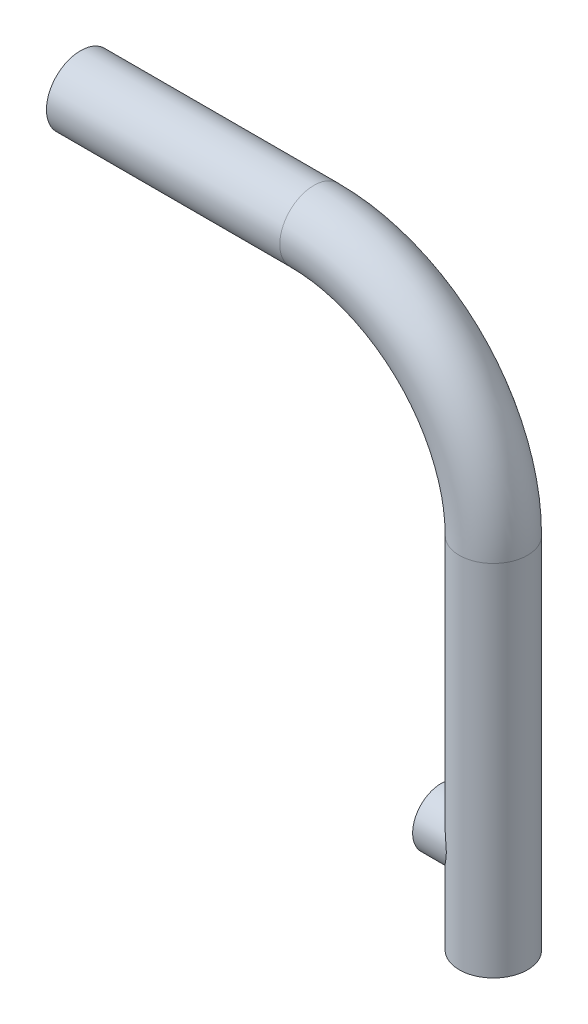
ISO-10303-21;
HEADER;
FILE_DESCRIPTION(('STEP AP214'),'2;1');
FILE_NAME('part.step','',(''),(''),'','','');
FILE_SCHEMA(('AUTOMOTIVE_DESIGN { 1 0 10303 214 1 1 1 1 }'));
ENDSEC;
DATA;
#1=APPLICATION_CONTEXT('core data for automotive mechanical design processes');
#2=APPLICATION_PROTOCOL_DEFINITION('international standard','automotive_design',2000,#1);
#3=PRODUCT_CONTEXT('',#1,'mechanical');
#4=PRODUCT('Part','Part','',(#3));
#5=PRODUCT_RELATED_PRODUCT_CATEGORY('part','',(#4));
#6=PRODUCT_DEFINITION_FORMATION('','',#4);
#7=PRODUCT_DEFINITION_CONTEXT('part definition',#1,'design');
#8=PRODUCT_DEFINITION('design','',#6,#7);
#9=PRODUCT_DEFINITION_SHAPE('','',#8);
#10=(LENGTH_UNIT() NAMED_UNIT(*) SI_UNIT(.MILLI.,.METRE.));
#11=(NAMED_UNIT(*) PLANE_ANGLE_UNIT() SI_UNIT($,.RADIAN.));
#12=(NAMED_UNIT(*) SI_UNIT($,.STERADIAN.) SOLID_ANGLE_UNIT());
#13=UNCERTAINTY_MEASURE_WITH_UNIT(LENGTH_MEASURE(1.E-05),#10,'distance_accuracy_value','');
#14=(GEOMETRIC_REPRESENTATION_CONTEXT(3) GLOBAL_UNCERTAINTY_ASSIGNED_CONTEXT((#13)) GLOBAL_UNIT_ASSIGNED_CONTEXT((#10,
#11,#12)) REPRESENTATION_CONTEXT('',''));
#15=CARTESIAN_POINT('',(0.,0.,0.));
#16=DIRECTION('',(0.,0.,1.));
#17=DIRECTION('',(1.,0.,0.));
#18=AXIS2_PLACEMENT_3D('',#15,#16,#17);
#19=CARTESIAN_POINT('',(80.2564105885616,-44.1229147782417,0.));
#20=DIRECTION('',(0.,-1.,0.));
#21=DIRECTION('',(1.,0.,0.));
#22=AXIS2_PLACEMENT_3D('',#19,#20,#21);
#23=CYLINDRICAL_SURFACE('',#22,19.);
#24=CARTESIAN_POINT('',(80.2564105885616,-244.122914778242,0.));
#25=DIRECTION('',(0.,1.,0.));
#26=DIRECTION('',(-1.,0.,0.));
#27=AXIS2_PLACEMENT_3D('',#24,#25,#26);
#28=CIRCLE('',#27,19.);
#29=CARTESIAN_POINT('',(61.2564105885616,-244.122914778242,0.));
#30=VERTEX_POINT('',#29);
#31=EDGE_CURVE('E64',#30,#30,#28,.T.);
#32=ORIENTED_EDGE('',*,*,#31,.T.);
#33=EDGE_LOOP('',(#32));
#34=FACE_BOUND('',#33,.T.);
#35=CARTESIAN_POINT('',(80.2564105885616,-44.1229147782417,0.));
#36=DIRECTION('',(0.,1.,0.));
#37=DIRECTION('',(-1.,0.,0.));
#38=AXIS2_PLACEMENT_3D('',#35,#36,#37);
#39=CIRCLE('',#38,19.);
#40=CARTESIAN_POINT('',(99.2564105885616,-44.1229147782417,0.));
#41=VERTEX_POINT('',#40);
#42=EDGE_CURVE('E69',#41,#41,#39,.T.);
#43=ORIENTED_EDGE('',*,*,#42,.F.);
#44=EDGE_LOOP('',(#43));
#45=FACE_BOUND('',#44,.T.);
#46=CARTESIAN_POINT('',(70.009459822602,-194.066559594014,-16.));
#47=CARTESIAN_POINT('',(70.0094526559944,-194.344324391861,-15.9999974132716));
#48=CARTESIAN_POINT('',(69.9981066117281,-194.622143252007,-15.9927465313038));
#49=CARTESIAN_POINT('',(69.9533396166383,-195.175349666771,-15.9639407215576));
#50=CARTESIAN_POINT('',(69.9199058030936,-195.450735709895,-15.9423774589891));
#51=CARTESIAN_POINT('',(69.832620377209,-195.99747759059,-15.8854429431641));
#52=CARTESIAN_POINT('',(69.7787176752074,-196.268821563585,-15.8500371327769));
#53=CARTESIAN_POINT('',(69.6529849059693,-196.805305746474,-15.7661998158233));
#54=CARTESIAN_POINT('',(69.5811476577037,-197.07044342473,-15.7177630910479));
#55=CARTESIAN_POINT('',(69.3906608513179,-197.697818231283,-15.5869684987352));
#56=CARTESIAN_POINT('',(69.2647648269802,-198.056641502405,-15.4987850613773));
#57=CARTESIAN_POINT('',(68.9906199837817,-198.75941922518,-15.300671531122));
#58=CARTESIAN_POINT('',(68.842359365878,-199.103365704194,-15.1907299495218));
#59=CARTESIAN_POINT('',(68.5293100555573,-199.777446504139,-14.9503897322486));
#60=CARTESIAN_POINT('',(68.3644766166108,-200.107539824882,-14.8199351460287));
#61=CARTESIAN_POINT('',(68.0236970562892,-200.753447102317,-14.5399249153233));
#62=CARTESIAN_POINT('',(67.8477515267534,-201.069261817965,-14.3903702876888));
#63=CARTESIAN_POINT('',(67.4041218832953,-201.83307569172,-13.9979573477446));
#64=CARTESIAN_POINT('',(67.1322999131043,-202.273185780088,-13.7443554862661));
#65=CARTESIAN_POINT('',(66.5832892170915,-203.125264134734,-13.1983309956678));
#66=CARTESIAN_POINT('',(66.3060981213371,-203.537219592702,-12.9058908736837));
#67=CARTESIAN_POINT('',(65.7545058367255,-204.332380156573,-12.2828235712926));
#68=CARTESIAN_POINT('',(65.4801022134147,-204.715612626916,-11.9522335192349));
#69=CARTESIAN_POINT('',(64.9406543285844,-205.452305268418,-11.2526721267967));
#70=CARTESIAN_POINT('',(64.6756064271122,-205.80577709413,-10.8837159386695));
#71=CARTESIAN_POINT('',(64.2167313006028,-206.407567518139,-10.191271750749));
#72=CARTESIAN_POINT('',(64.0198858387309,-206.662108341304,-9.87517494273733));
#73=CARTESIAN_POINT('',(63.6388310518982,-207.149643373913,-9.21953195567225));
#74=CARTESIAN_POINT('',(63.4546212653549,-207.382638370535,-8.87998663410557));
#75=CARTESIAN_POINT('',(63.1021999632342,-207.824636992283,-8.17844435309756));
#76=CARTESIAN_POINT('',(62.9339675856759,-208.033671978349,-7.8164777196354));
#77=CARTESIAN_POINT('',(62.6164278761091,-208.42560494244,-7.07072443978614));
#78=CARTESIAN_POINT('',(62.4671170308675,-208.608507773327,-6.68694186327398));
#79=CARTESIAN_POINT('',(62.2149285324614,-208.915847763382,-5.96852668943652));
#80=CARTESIAN_POINT('',(62.1085023792318,-209.044910547347,-5.63711326826689));
#81=CARTESIAN_POINT('',(61.9124223486733,-209.281891861819,-4.96201375062467));
#82=CARTESIAN_POINT('',(61.8227652371479,-209.389814469762,-4.61833003594706));
#83=CARTESIAN_POINT('',(61.6618576400204,-209.583010770158,-3.92055342288623));
#84=CARTESIAN_POINT('',(61.5906006463245,-209.668292470966,-3.56646425438804));
#85=CARTESIAN_POINT('',(61.4678562412792,-209.814936833805,-2.84996743837542));
#86=CARTESIAN_POINT('',(61.4163690551863,-209.876299223299,-2.48755969612929));
#87=CARTESIAN_POINT('',(61.3340735946626,-209.974279384822,-1.75540748526202));
#88=CARTESIAN_POINT('',(61.3033584695978,-210.010785698193,-1.38563752366775));
#89=CARTESIAN_POINT('',(61.2636659628452,-210.057948257497,-0.643280762374963));
#90=CARTESIAN_POINT('',(61.2546886265538,-210.068604449447,-0.270693956795509));
#91=CARTESIAN_POINT('',(61.2586773716293,-210.063867761667,0.474178855467361));
#92=CARTESIAN_POINT('',(61.2716425909903,-210.048475905227,0.846464873392307));
#93=CARTESIAN_POINT('',(61.3192189015208,-209.991931264095,1.58766200894079));
#94=CARTESIAN_POINT('',(61.3538291778484,-209.950779449153,1.95657325307938));
#95=CARTESIAN_POINT('',(61.4407242001684,-209.847268776043,2.66218729119098));
#96=CARTESIAN_POINT('',(61.4915828320492,-209.786619179965,2.99932009383728));
#97=CARTESIAN_POINT('',(61.6103811806391,-209.644618701966,3.66609558882488));
#98=CARTESIAN_POINT('',(61.6783199029461,-209.5632690252,3.99573871599689));
#99=CARTESIAN_POINT('',(61.8301228440137,-209.380952431585,4.64578759618012));
#100=CARTESIAN_POINT('',(61.913987615864,-209.279984833431,4.96619302793375));
#101=CARTESIAN_POINT('',(62.096324828296,-209.059642656615,5.59632827158694));
#102=CARTESIAN_POINT('',(62.1947981806717,-208.940266928992,5.90605741563841));
#103=CARTESIAN_POINT('',(62.4135860113287,-208.673839894684,6.53870466215178));
#104=CARTESIAN_POINT('',(62.5350307061248,-208.525319909599,6.86061247174463));
#105=CARTESIAN_POINT('',(62.7915312750707,-208.209771871296,7.48955002903106));
#106=CARTESIAN_POINT('',(62.9265875346631,-208.042743293951,7.79657935504148));
#107=CARTESIAN_POINT('',(63.2085564121969,-207.691547819866,8.39524908960755));
#108=CARTESIAN_POINT('',(63.3554760731088,-207.507370732454,8.68688018422615));
#109=CARTESIAN_POINT('',(63.6593018145617,-207.123274834789,9.25416481867157));
#110=CARTESIAN_POINT('',(63.8162098704018,-206.923352908981,9.5298151774344));
#111=CARTESIAN_POINT('',(64.2166582636147,-206.408009457074,10.1951868281285));
#112=CARTESIAN_POINT('',(64.4651847491201,-206.083742996398,10.5751081651732));
#113=CARTESIAN_POINT('',(64.9746961210211,-205.405908883411,11.2989033730554));
#114=CARTESIAN_POINT('',(65.2356866853815,-205.052327821905,11.642760582594));
#115=CARTESIAN_POINT('',(65.764665292189,-204.317218530551,12.2949536390451));
#116=CARTESIAN_POINT('',(66.0326651276411,-203.935640951345,12.6032241714526));
#117=CARTESIAN_POINT('',(66.5687206229712,-203.14604618607,13.183434640534));
#118=CARTESIAN_POINT('',(66.8367762326857,-202.738038056249,13.4553869246455));
#119=CARTESIAN_POINT('',(67.2996652754574,-201.999904385659,13.899590876647));
#120=CARTESIAN_POINT('',(67.4961521959707,-201.6755979274,14.0798308691496));
#121=CARTESIAN_POINT('',(67.8808359576272,-201.011218446468,14.4191146943914));
#122=CARTESIAN_POINT('',(68.0690320259053,-200.671143959953,14.578156553849));
#123=CARTESIAN_POINT('',(68.4316070427296,-199.975363656054,14.8737552808811));
#124=CARTESIAN_POINT('',(68.6060177311384,-199.619696862292,15.0103646292503));
#125=CARTESIAN_POINT('',(68.9350490342606,-198.891355683295,15.26005821871));
#126=CARTESIAN_POINT('',(69.089680229632,-198.518690536966,15.3731550577817));
#127=CARTESIAN_POINT('',(69.321705587485,-197.890237331243,15.5384959915012));
#128=CARTESIAN_POINT('',(69.4071535193275,-197.639364519259,15.5981623733734));
#129=CARTESIAN_POINT('',(69.5638304968046,-197.13082844317,15.7059787542427));
#130=CARTESIAN_POINT('',(69.6350645642333,-196.87316761384,15.754132821765));
#131=CARTESIAN_POINT('',(69.7606557142116,-196.352293942971,15.8380821933515));
#132=CARTESIAN_POINT('',(69.8150461102697,-196.089093174422,15.8739019082876));
#133=CARTESIAN_POINT('',(69.9047950505877,-195.558000677199,15.9325751375315));
#134=CARTESIAN_POINT('',(69.9401542796204,-195.290109117665,15.9554291183694));
#135=CARTESIAN_POINT('',(69.9903020744348,-194.749248842477,15.9877432145455));
#136=CARTESIAN_POINT('',(70.0049119779773,-194.476256296058,15.9970870126134));
#137=CARTESIAN_POINT('',(70.0121893984186,-193.929864998533,16.0017484326013));
#138=CARTESIAN_POINT('',(70.0048576915314,-193.656466262139,15.9970665506987));
#139=CARTESIAN_POINT('',(69.968639530436,-193.11143182339,15.9737978642688));
#140=CARTESIAN_POINT('',(69.939730639598,-192.83979825329,15.9551965858664));
#141=CARTESIAN_POINT('',(69.8618439697079,-192.300707633455,15.9045627610877));
#142=CARTESIAN_POINT('',(69.812862878019,-192.033251280679,15.8725279976816));
#143=CARTESIAN_POINT('',(69.6839988962992,-191.444339197193,15.7870628562369));
#144=CARTESIAN_POINT('',(69.5996351175079,-191.124331368014,15.7304341918573));
#145=CARTESIAN_POINT('',(69.4089209357642,-190.494693975531,15.5995288061324));
#146=CARTESIAN_POINT('',(69.3025636615142,-190.185067690891,15.5252465683004));
#147=CARTESIAN_POINT('',(69.0722489050903,-189.57598925959,15.3601638187153));
#148=CARTESIAN_POINT('',(68.9482424767407,-189.276568378064,15.2693171652119));
#149=CARTESIAN_POINT('',(68.6870120271868,-188.688804900612,15.0723529128142));
#150=CARTESIAN_POINT('',(68.5497874519644,-188.400462769746,14.9662346737429));
#151=CARTESIAN_POINT('',(68.1790511174416,-187.66201409987,14.6704694093156));
#152=CARTESIAN_POINT('',(67.9378073559835,-187.220368156043,14.4693189204878));
#153=CARTESIAN_POINT('',(67.4414904295106,-186.363043205597,14.0316635576138));
#154=CARTESIAN_POINT('',(67.186409557972,-185.947378952569,13.7951388504856));
#155=CARTESIAN_POINT('',(66.6705374062404,-185.140634488356,13.2874084859563));
#156=CARTESIAN_POINT('',(66.4097393541105,-184.749585820882,13.0161596285378));
#157=CARTESIAN_POINT('',(65.8895144786231,-183.992675152031,12.4395787757339));
#158=CARTESIAN_POINT('',(65.6300873840334,-183.626807982238,12.1342538082821));
#159=CARTESIAN_POINT('',(65.1096667887173,-182.90919144038,11.4785535846209));
#160=CARTESIAN_POINT('',(64.8489149099035,-182.558332816372,11.1270072249177));
#161=CARTESIAN_POINT('',(64.3408373749021,-181.886505623853,10.3872986022929));
#162=CARTESIAN_POINT('',(64.0935142621657,-181.565542709505,9.99912944074695));
#163=CARTESIAN_POINT('',(63.6187924467247,-180.957544268041,9.18748707196169));
#164=CARTESIAN_POINT('',(63.3913412994135,-180.670418694459,8.76411292469729));
#165=CARTESIAN_POINT('',(63.0692030935064,-180.267772057135,8.1030872161576));
#166=CARTESIAN_POINT('',(62.9650122496828,-180.138249008801,7.87845672812986));
#167=CARTESIAN_POINT('',(62.7636538975671,-179.88904442821,7.4206464760882));
#168=CARTESIAN_POINT('',(62.6664879980322,-179.769365149382,7.18746477210308));
#169=CARTESIAN_POINT('',(62.4473482192124,-179.500478454274,6.6299082466765));
#170=CARTESIAN_POINT('',(62.3285848087609,-179.355584897766,6.30216465690627));
#171=CARTESIAN_POINT('',(62.1072262672875,-179.086615513067,5.63304971821279));
#172=CARTESIAN_POINT('',(62.0046267440221,-178.962534028979,5.29168210308107));
#173=CARTESIAN_POINT('',(61.8173973231338,-178.736811279047,4.5969683362017));
#174=CARTESIAN_POINT('',(61.7327585302797,-178.635158903966,4.24362821498651));
#175=CARTESIAN_POINT('',(61.5830221753146,-178.455733884517,3.52684024959074));
#176=CARTESIAN_POINT('',(61.5179251985831,-178.377961955492,3.16339210297826));
#177=CARTESIAN_POINT('',(61.4083360591832,-178.247229870777,2.42682412778136));
#178=CARTESIAN_POINT('',(61.3639614594914,-178.194411261956,2.0536615001948));
#179=CARTESIAN_POINT('',(61.2973639382246,-178.115198805636,1.30256662997782));
#180=CARTESIAN_POINT('',(61.2751409533951,-178.08880488268,0.924634400970232));
#181=CARTESIAN_POINT('',(61.253370442362,-178.062948018694,0.16724949974826));
#182=CARTESIAN_POINT('',(61.2538196313038,-178.063481176337,-0.212202944244198));
#183=CARTESIAN_POINT('',(61.2773765433796,-178.091460486605,-0.969390122756827));
#184=CARTESIAN_POINT('',(61.300483024361,-178.118905163845,-1.34712495030226));
#185=CARTESIAN_POINT('',(61.3659044873758,-178.196725971376,-2.06586036144871));
#186=CARTESIAN_POINT('',(61.4064252983877,-178.244961195803,-2.40726072967014));
#187=CARTESIAN_POINT('',(61.5052098526489,-178.362784234435,-3.08371454189126));
#188=CARTESIAN_POINT('',(61.5634723818538,-178.432370587611,-3.41876841850782));
#189=CARTESIAN_POINT('',(61.6967041652384,-178.59191493645,-4.08059609367622));
#190=CARTESIAN_POINT('',(61.7716744310161,-178.68187416563,-4.40736938953163));
#191=CARTESIAN_POINT('',(61.937077513629,-178.881006029729,-5.05098606655071));
#192=CARTESIAN_POINT('',(62.0275112368344,-178.990179790894,-5.36782886436258));
#193=CARTESIAN_POINT('',(62.2281500743601,-179.233381443092,-6.00840600876526));
#194=CARTESIAN_POINT('',(62.3392004213443,-179.368487174667,-6.33146543103493));
#195=CARTESIAN_POINT('',(62.5753595568589,-179.657309903853,-6.96378934704844));
#196=CARTESIAN_POINT('',(62.7004685061914,-179.811027114343,-7.27305368294784));
#197=CARTESIAN_POINT('',(62.96305952962,-180.135690521872,-7.87708716093582));
#198=CARTESIAN_POINT('',(63.1005464239351,-180.306643433969,-8.17185058637751));
#199=CARTESIAN_POINT('',(63.3861388630252,-180.66440801959,-8.74624849132592));
#200=CARTESIAN_POINT('',(63.5342465404627,-180.851222879599,-9.02587991242202));
#201=CARTESIAN_POINT('',(63.9130139086972,-181.333202285734,-9.70087253765006));
#202=CARTESIAN_POINT('',(64.1490324014537,-181.637163238873,-10.0869934565013));
#203=CARTESIAN_POINT('',(64.635331492718,-182.2741682034,-10.8248452610186));
#204=CARTESIAN_POINT('',(64.885618258326,-182.607224824279,-11.1765610948235));
#205=CARTESIAN_POINT('',(65.3955968644828,-183.300908308056,-11.8462535924907));
#206=CARTESIAN_POINT('',(65.6553091669035,-183.661597307307,-12.1641501345621));
#207=CARTESIAN_POINT('',(66.1778251366172,-184.408510166374,-12.7652614297872));
#208=CARTESIAN_POINT('',(66.4406280004112,-184.794727504806,-13.0484849880606));
#209=CARTESIAN_POINT('',(66.9229806648369,-185.531598398463,-13.5395477866699));
#210=CARTESIAN_POINT('',(67.1430080878358,-185.878678627414,-13.7522944256941));
#211=CARTESIAN_POINT('',(67.5759160849928,-186.591582498684,-14.1524520769283));
#212=CARTESIAN_POINT('',(67.7887952898157,-186.957409698706,-14.3398582554176));
#213=CARTESIAN_POINT('',(68.2008773930173,-187.707791581296,-14.6879764647517));
#214=CARTESIAN_POINT('',(68.4001111145236,-188.092300460656,-14.8487499056673));
#215=CARTESIAN_POINT('',(68.7775104511548,-188.881448644908,-15.1423897714508));
#216=CARTESIAN_POINT('',(68.9556909462543,-189.28607344143,-15.275275958621));
#217=CARTESIAN_POINT('',(69.3183680094555,-190.211663729366,-15.5377014507424));
#218=CARTESIAN_POINT('',(69.4950358459204,-190.738115186038,-15.6595643681203));
#219=CARTESIAN_POINT('',(69.7075628001048,-191.547470847185,-15.8028204960244));
#220=CARTESIAN_POINT('',(69.7696110317306,-191.820156419065,-15.8439539939879));
#221=CARTESIAN_POINT('',(69.8736360976062,-192.370993583623,-15.9123190736983));
#222=CARTESIAN_POINT('',(69.915625965467,-192.64914150427,-15.9395596836072));
#223=CARTESIAN_POINT('',(69.9673129429056,-193.117501645506,-15.972947679856));
#224=CARTESIAN_POINT('',(69.9830768624681,-193.306784453255,-15.9830777127936));
#225=CARTESIAN_POINT('',(70.0041540612251,-193.686222786583,-15.9966055993842));
#226=CARTESIAN_POINT('',(70.0094647294626,-193.876378518312,-16.0000017710912));
#227=CARTESIAN_POINT('',(70.009459822602,-194.066559594014,-16.));
#228=B_SPLINE_CURVE_WITH_KNOTS('',3,(#46,#47,#48,#49,#50,#51,#52,#53,#54,#55,#56,#57,#58,#59,
#60,#61,#62,#63,#64,#65,#66,#67,#68,#69,#70,#71,#72,#73,#74,#75,#76,#77,#78,#79,#80,#81,#82,#83,
#84,#85,#86,#87,#88,#89,#90,#91,#92,#93,#94,#95,#96,#97,#98,#99,#100,#101,#102,#103,#104,#105,
#106,#107,#108,#109,#110,#111,#112,#113,#114,#115,#116,#117,#118,#119,#120,#121,#122,#123,#124,
#125,#126,#127,#128,#129,#130,#131,#132,#133,#134,#135,#136,#137,#138,#139,#140,#141,#142,#143,
#144,#145,#146,#147,#148,#149,#150,#151,#152,#153,#154,#155,#156,#157,#158,#159,#160,#161,#162,
#163,#164,#165,#166,#167,#168,#169,#170,#171,#172,#173,#174,#175,#176,#177,#178,#179,#180,#181,
#182,#183,#184,#185,#186,#187,#188,#189,#190,#191,#192,#193,#194,#195,#196,#197,#198,#199,#200,
#201,#202,#203,#204,#205,#206,#207,#208,#209,#210,#211,#212,#213,#214,#215,#216,#217,#218,#219,
#220,#221,#222,#223,#224,#225,#226,#227),.UNSPECIFIED.,.T.,.F.,(4,2,2,2,2,2,2,2,2,2,2,2,2,2,2,2,
2,2,2,2,2,2,2,2,2,2,2,2,2,2,2,2,2,2,2,2,2,2,2,2,2,2,2,2,2,2,2,2,2,2,2,2,2,2,2,2,2,2,2,2,2,2,2,2,
2,2,2,2,2,2,2,2,2,2,2,2,2,2,2,2,2,2,2,2,2,2,2,2,2,2,4),(0.,0.833071065925681,1.66662769549526,
2.50227867719614,3.33826479339819,4.50741719893909,5.67718859362159,6.85020780380853,
8.02316459061828,9.7492027538413,11.476020982959,13.2011725869337,14.925645431837,
16.2776578688644,17.6296208904181,18.9797936352633,20.3297153199358,21.4423412875177,
22.5547524443719,23.6667696024863,24.7787994305107,25.8957835064536,27.0127699150576,
28.1297124442395,29.2466129279474,30.2843738915467,31.3220744507378,32.3598110544216,
33.3976124556591,34.5207660872612,35.6439515324767,36.7678087544714,37.8918889244424,
39.5632270522933,41.2353339531253,42.910462561412,44.5850202035725,45.8437523071172,
47.1026015012049,48.3584623168349,49.6136484992452,50.4280356076499,51.2421344795964,
52.0546127844215,52.8670618529806,53.6864649662311,54.505839092339,55.326066418321,
56.1464291659408,57.1520854250092,58.1580563512892,59.166873547509,60.1757330451562,
61.799171668836,63.4235239336072,65.0499170457846,66.6759753446919,68.3568094376246,
70.0379607832516,71.7145321572496,72.5525439922034,73.3907471332985,74.522135806753,
75.6532165135848,76.7837357272089,77.9142888024106,79.0511801063487,80.188068163858,
81.3247915039796,82.4614525284015,83.5017674334894,84.5420111670812,85.5823179010951,
86.6226856322193,87.7236994553922,88.824725873221,89.9261829227864,91.02786176858,
92.6609573908163,94.2947643094328,95.9323595279928,97.5695380167735,98.9567516591856,
100.344229541956,101.728462235203,103.111710654573,104.810455273359,105.657555103267,
106.504103749693,107.074351652595,107.644741970886),.UNSPECIFIED.);
#229=CARTESIAN_POINT('',(70.009459822602,-194.066559594014,-16.));
#230=VERTEX_POINT('',#229);
#231=EDGE_CURVE('E11',#230,#230,#228,.T.);
#232=ORIENTED_EDGE('',*,*,#231,.F.);
#233=EDGE_LOOP('',(#232));
#234=FACE_BOUND('',#233,.T.);
#235=ADVANCED_FACE('F51',(#34,#45,#234),#23,.T.);
#236=CARTESIAN_POINT('',(-149.743589411438,55.8770852217582,0.));
#237=DIRECTION('',(-1.,0.,0.));
#238=DIRECTION('',(0.,-1.,0.));
#239=AXIS2_PLACEMENT_3D('',#236,#237,#238);
#240=PLANE('',#239);
#241=CARTESIAN_POINT('',(-149.743589411438,55.8770852217582,0.));
#242=DIRECTION('',(-1.,0.,0.));
#243=DIRECTION('',(0.,-1.,0.));
#244=AXIS2_PLACEMENT_3D('',#241,#242,#243);
#245=CIRCLE('',#244,15.);
#246=CARTESIAN_POINT('',(-149.743589411438,40.8770852217582,0.));
#247=VERTEX_POINT('',#246);
#248=EDGE_CURVE('E96',#247,#247,#245,.T.);
#249=ORIENTED_EDGE('',*,*,#248,.F.);
#250=EDGE_LOOP('',(#249));
#251=FACE_BOUND('',#250,.T.);
#252=CARTESIAN_POINT('',(-149.743589411438,55.8770852217582,0.));
#253=DIRECTION('',(-1.,0.,0.));
#254=DIRECTION('',(0.,-1.,0.));
#255=AXIS2_PLACEMENT_3D('',#252,#253,#254);
#256=CIRCLE('',#255,19.);
#257=CARTESIAN_POINT('',(-149.743589411438,36.8770852217582,0.));
#258=VERTEX_POINT('',#257);
#259=EDGE_CURVE('E77',#258,#258,#256,.T.);
#260=ORIENTED_EDGE('',*,*,#259,.T.);
#261=EDGE_LOOP('',(#260));
#262=FACE_BOUND('',#261,.T.);
#263=ADVANCED_FACE('F144',(#251,#262),#240,.T.);
#264=CARTESIAN_POINT('',(80.2564105885616,-244.122914778242,0.));
#265=DIRECTION('',(0.,1.,0.));
#266=DIRECTION('',(-1.,0.,0.));
#267=AXIS2_PLACEMENT_3D('',#264,#265,#266);
#268=PLANE('',#267);
#269=CARTESIAN_POINT('',(80.2564105885616,-244.122914778242,0.));
#270=DIRECTION('',(0.,1.,0.));
#271=DIRECTION('',(-1.,0.,0.));
#272=AXIS2_PLACEMENT_3D('',#269,#270,#271);
#273=CIRCLE('',#272,15.);
#274=CARTESIAN_POINT('',(65.2564105885616,-244.122914778242,0.));
#275=VERTEX_POINT('',#274);
#276=EDGE_CURVE('E80',#275,#275,#273,.T.);
#277=ORIENTED_EDGE('',*,*,#276,.T.);
#278=EDGE_LOOP('',(#277));
#279=FACE_BOUND('',#278,.T.);
#280=ORIENTED_EDGE('',*,*,#31,.F.);
#281=EDGE_LOOP('',(#280));
#282=FACE_BOUND('',#281,.T.);
#283=ADVANCED_FACE('F145',(#279,#282),#268,.F.);
#284=CARTESIAN_POINT('',(-149.743589411438,55.8770852217582,0.));
#285=DIRECTION('',(1.,0.,0.));
#286=DIRECTION('',(0.,0.,-1.));
#287=AXIS2_PLACEMENT_3D('',#284,#285,#286);
#288=CYLINDRICAL_SURFACE('',#287,19.);
#289=CARTESIAN_POINT('',(-19.7435894114385,55.8770852217582,0.));
#290=DIRECTION('',(1.,0.,0.));
#291=DIRECTION('',(0.,0.,-1.));
#292=AXIS2_PLACEMENT_3D('',#289,#290,#291);
#293=CIRCLE('',#292,19.);
#294=CARTESIAN_POINT('',(-19.7435894114385,74.8770852217582,0.));
#295=VERTEX_POINT('',#294);
#296=EDGE_CURVE('E74',#295,#295,#293,.F.);
#297=ORIENTED_EDGE('',*,*,#296,.T.);
#298=EDGE_LOOP('',(#297));
#299=FACE_BOUND('',#298,.T.);
#300=ORIENTED_EDGE('',*,*,#259,.F.);
#301=EDGE_LOOP('',(#300));
#302=FACE_BOUND('',#301,.T.);
#303=ADVANCED_FACE('F148',(#299,#302),#288,.T.);
#304=CARTESIAN_POINT('',(-19.7435894114384,-44.1229147782417,0.));
#305=DIRECTION('',(0.,0.,-1.));
#306=DIRECTION('',(-1.,0.,0.));
#307=AXIS2_PLACEMENT_3D('',#304,#305,#306);
#308=TOROIDAL_SURFACE('',#307,100.,19.);
#309=CARTESIAN_POINT('',(-19.7435894114384,-44.1229147782417,0.));
#310=DIRECTION('',(0.,0.,-1.));
#311=DIRECTION('',(-1.,0.,0.));
#312=AXIS2_PLACEMENT_3D('',#309,#310,#311);
#313=CIRCLE('',#312,119.);
#314=EDGE_CURVE('',#295,#41,#313,.T.);
#315=ORIENTED_EDGE('',*,*,#296,.F.);
#316=ORIENTED_EDGE('',*,*,#42,.T.);
#317=ORIENTED_EDGE('',*,*,#314,.T.);
#318=ORIENTED_EDGE('',*,*,#314,.F.);
#319=EDGE_LOOP('',(#315,#317,#316,#318));
#320=FACE_BOUND('',#319,.T.);
#321=ADVANCED_FACE('F136',(#320),#308,.T.);
#322=CARTESIAN_POINT('',(-149.743589411438,55.8770852217582,0.));
#323=DIRECTION('',(1.,0.,0.));
#324=DIRECTION('',(0.,0.,-1.));
#325=AXIS2_PLACEMENT_3D('',#322,#323,#324);
#326=CYLINDRICAL_SURFACE('',#325,15.);
#327=CARTESIAN_POINT('',(-19.7435894114385,55.8770852217582,0.));
#328=DIRECTION('',(-1.,0.,0.));
#329=DIRECTION('',(0.,-1.,0.));
#330=AXIS2_PLACEMENT_3D('',#327,#328,#329);
#331=CIRCLE('',#330,15.);
#332=CARTESIAN_POINT('',(-19.7435894114385,70.8770852217582,0.));
#333=VERTEX_POINT('',#332);
#334=EDGE_CURVE('E92',#333,#333,#331,.T.);
#335=ORIENTED_EDGE('',*,*,#334,.F.);
#336=EDGE_LOOP('',(#335));
#337=FACE_BOUND('',#336,.T.);
#338=ORIENTED_EDGE('',*,*,#248,.T.);
#339=EDGE_LOOP('',(#338));
#340=FACE_BOUND('',#339,.T.);
#341=ADVANCED_FACE('F132',(#337,#340),#326,.F.);
#342=CARTESIAN_POINT('',(-19.7435894114384,-44.1229147782417,0.));
#343=DIRECTION('',(0.,0.,-1.));
#344=DIRECTION('',(-1.,0.,0.));
#345=AXIS2_PLACEMENT_3D('',#342,#343,#344);
#346=TOROIDAL_SURFACE('',#345,100.,15.);
#347=CARTESIAN_POINT('',(80.2564105885616,-44.1229147782418,0.));
#348=DIRECTION('',(0.,1.,0.));
#349=DIRECTION('',(-1.,0.,0.));
#350=AXIS2_PLACEMENT_3D('',#347,#348,#349);
#351=CIRCLE('',#350,15.);
#352=CARTESIAN_POINT('',(95.2564105885616,-44.1229147782418,0.));
#353=VERTEX_POINT('',#352);
#354=EDGE_CURVE('E88',#353,#353,#351,.T.);
#355=CARTESIAN_POINT('',(-19.7435894114384,-44.1229147782417,0.));
#356=DIRECTION('',(0.,0.,-1.));
#357=DIRECTION('',(-1.,0.,0.));
#358=AXIS2_PLACEMENT_3D('',#355,#356,#357);
#359=CIRCLE('',#358,115.);
#360=EDGE_CURVE('',#333,#353,#359,.T.);
#361=ORIENTED_EDGE('',*,*,#334,.T.);
#362=ORIENTED_EDGE('',*,*,#354,.F.);
#363=ORIENTED_EDGE('',*,*,#360,.T.);
#364=ORIENTED_EDGE('',*,*,#360,.F.);
#365=EDGE_LOOP('',(#361,#363,#362,#364));
#366=FACE_BOUND('',#365,.T.);
#367=ADVANCED_FACE('F135',(#366),#346,.F.);
#368=CARTESIAN_POINT('',(80.2564105885616,-44.1229147782417,0.));
#369=DIRECTION('',(0.,-1.,0.));
#370=DIRECTION('',(1.,0.,0.));
#371=AXIS2_PLACEMENT_3D('',#368,#369,#370);
#372=CYLINDRICAL_SURFACE('',#371,15.);
#373=ORIENTED_EDGE('',*,*,#276,.F.);
#374=EDGE_LOOP('',(#373));
#375=FACE_BOUND('',#374,.T.);
#376=ORIENTED_EDGE('',*,*,#354,.T.);
#377=EDGE_LOOP('',(#376));
#378=FACE_BOUND('',#377,.T.);
#379=ADVANCED_FACE('F130',(#375,#378),#372,.F.);
#380=CARTESIAN_POINT('',(51.2564105885616,-194.066559594014,0.));
#381=DIRECTION('',(1.,0.,0.));
#382=DIRECTION('',(0.,0.,-1.));
#383=AXIS2_PLACEMENT_3D('',#380,#381,#382);
#384=CYLINDRICAL_SURFACE('',#383,14.);
#385=CARTESIAN_POINT('',(51.2564105885616,-194.066559594014,0.));
#386=DIRECTION('',(-1.,0.,0.));
#387=DIRECTION('',(0.,0.,1.));
#388=AXIS2_PLACEMENT_3D('',#385,#386,#387);
#389=CIRCLE('',#388,14.);
#390=CARTESIAN_POINT('',(51.2564105885616,-194.066559594014,14.));
#391=VERTEX_POINT('',#390);
#392=EDGE_CURVE('E104',#391,#391,#389,.T.);
#393=ORIENTED_EDGE('',*,*,#392,.T.);
#394=EDGE_LOOP('',(#393));
#395=FACE_BOUND('',#394,.T.);
#396=CARTESIAN_POINT('',(67.4111780098965,-194.066559594014,14.));
#397=CARTESIAN_POINT('',(67.4111854481021,-193.737304137991,14.0000036110362));
#398=CARTESIAN_POINT('',(67.3984565254645,-193.40808390171,13.9883588077584));
#399=CARTESIAN_POINT('',(67.3483243319154,-192.753022666362,13.9421114038126));
#400=CARTESIAN_POINT('',(67.3109096854751,-192.427183295591,13.907498218949));
#401=CARTESIAN_POINT('',(67.2134160834233,-191.78141114635,13.816103751955));
#402=CARTESIAN_POINT('',(67.1532883796487,-191.461492635895,13.7592747797161));
#403=CARTESIAN_POINT('',(67.0133641302052,-190.830342149087,13.6246511005455));
#404=CARTESIAN_POINT('',(66.9335548590026,-190.519115938439,13.5468428259516));
#405=CARTESIAN_POINT('',(66.7588741195958,-189.91118221211,13.3727887805541));
#406=CARTESIAN_POINT('',(66.6642215508959,-189.614335055808,13.2768073067757));
#407=CARTESIAN_POINT('',(66.4623571766429,-189.031620410542,13.0669533306122));
#408=CARTESIAN_POINT('',(66.3551497439323,-188.745749144482,12.9530870527936));
#409=CARTESIAN_POINT('',(66.1311463785813,-188.185311900773,12.7084384935418));
#410=CARTESIAN_POINT('',(66.0143515698262,-187.91074460366,12.5776581938322));
#411=CARTESIAN_POINT('',(65.773833552881,-187.373066569716,12.2999478715868));
#412=CARTESIAN_POINT('',(65.6501098612109,-187.109956634634,12.1530167213945));
#413=CARTESIAN_POINT('',(65.3729379081633,-186.543909873609,11.8126846762406));
#414=CARTESIAN_POINT('',(65.2184885798274,-186.243515175081,11.6158639080711));
#415=CARTESIAN_POINT('',(64.9066668602348,-185.659686300978,11.200572515398));
#416=CARTESIAN_POINT('',(64.7492942335419,-185.376253499307,10.9821001409237));
#417=CARTESIAN_POINT('',(64.4346324590106,-184.826454938273,10.5237216406977));
#418=CARTESIAN_POINT('',(64.2773437014561,-184.560112410681,10.2837873579603));
#419=CARTESIAN_POINT('',(63.9660147089305,-184.045635544928,9.78314496246692));
#420=CARTESIAN_POINT('',(63.8119747319329,-183.797502648877,9.52243520780365));
#421=CARTESIAN_POINT('',(63.4806234303604,-183.27417046793,8.92804956097763));
#422=CARTESIAN_POINT('',(63.3045952833682,-183.003059735747,8.59003059660378));
#423=CARTESIAN_POINT('',(62.9657504353794,-182.490555802713,7.88579637783006));
#424=CARTESIAN_POINT('',(62.8029365582255,-182.249168948079,7.51957512911663));
#425=CARTESIAN_POINT('',(62.4953799192038,-181.799487585042,6.76113421349756));
#426=CARTESIAN_POINT('',(62.3506046787987,-181.591133411466,6.36896327761873));
#427=CARTESIAN_POINT('',(62.0832740409125,-181.210383205166,5.56040851596713));
#428=CARTESIAN_POINT('',(61.9607074785507,-181.037969097842,5.14403699629143));
#429=CARTESIAN_POINT('',(61.7740044630975,-180.777279199751,4.41563002412012));
#430=CARTESIAN_POINT('',(61.7032702287618,-180.679152491159,4.10876943235665));
#431=CARTESIAN_POINT('',(61.5762903416995,-180.503721885412,3.48624897670375));
#432=CARTESIAN_POINT('',(61.5200413384237,-180.426413172701,3.17059116643561));
#433=CARTESIAN_POINT('',(61.4231898017938,-180.293678172446,2.53255748518262));
#434=CARTESIAN_POINT('',(61.3825769660026,-180.2382374758,2.21018618574166));
#435=CARTESIAN_POINT('',(61.317806878592,-180.149964753864,1.56070004601407));
#436=CARTESIAN_POINT('',(61.2936502087765,-180.117133527925,1.23358503843232));
#437=CARTESIAN_POINT('',(61.2622935700926,-180.074537203876,0.576237824020255));
#438=CARTESIAN_POINT('',(61.2551350672847,-180.064828511698,0.245999963380244));
#439=CARTESIAN_POINT('',(61.2580586168318,-180.06879622362,-0.414256888148521));
#440=CARTESIAN_POINT('',(61.2681406021858,-180.08247253684,-0.744275879882871));
#441=CARTESIAN_POINT('',(61.3053198843639,-180.132998297638,-1.40162962442476));
#442=CARTESIAN_POINT('',(61.332420746699,-180.169852601084,-1.72896380019294));
#443=CARTESIAN_POINT('',(61.4030404127093,-180.266174141923,-2.37847702008329));
#444=CARTESIAN_POINT('',(61.4465591418806,-180.3256412767,-2.70065608759229));
#445=CARTESIAN_POINT('',(61.5474829080127,-180.464127901674,-3.32771957585502));
#446=CARTESIAN_POINT('',(61.6044109766168,-180.542477575283,-3.63282973660964));
#447=CARTESIAN_POINT('',(61.7317307571139,-180.718620951157,-4.23447638193975));
#448=CARTESIAN_POINT('',(61.8021220929001,-180.816414110258,-4.53101310575452));
#449=CARTESIAN_POINT('',(61.9551373001267,-181.030371707134,-5.11412442248884));
#450=CARTESIAN_POINT('',(62.0377616896832,-181.146536923049,-5.40069859282143));
#451=CARTESIAN_POINT('',(62.2139055108707,-181.396129207015,-5.96278292889669));
#452=CARTESIAN_POINT('',(62.3074264211622,-181.529558618094,-6.2382915862092));
#453=CARTESIAN_POINT('',(62.5147259941222,-181.828089573808,-6.80690484979));
#454=CARTESIAN_POINT('',(62.6296015178664,-181.995059613317,-7.09862843903743));
#455=CARTESIAN_POINT('',(62.8690598193592,-182.347486036136,-7.66648621372022));
#456=CARTESIAN_POINT('',(62.9936431975159,-182.532943563051,-7.94261943310304));
#457=CARTESIAN_POINT('',(63.2506168858589,-182.921236508314,-8.47888234394334));
#458=CARTESIAN_POINT('',(63.3830128940122,-183.124084660197,-8.73900006513496));
#459=CARTESIAN_POINT('',(63.6535140530742,-183.545990117118,-9.24259398621962));
#460=CARTESIAN_POINT('',(63.7916197557716,-183.765048990395,-9.48606857164713));
#461=CARTESIAN_POINT('',(64.0984400342039,-184.262206388398,-10.0013171614119));
#462=CARTESIAN_POINT('',(64.2679265503843,-184.543549642761,-10.2695090441241));
#463=CARTESIAN_POINT('',(64.6084396672132,-185.12703227626,-10.7812562057621));
#464=CARTESIAN_POINT('',(64.7794665650256,-185.429175746154,-11.0248066150774));
#465=CARTESIAN_POINT('',(65.1191050537752,-186.053649869487,-11.4866954223694));
#466=CARTESIAN_POINT('',(65.2877157384546,-186.375987865817,-11.7050245666668));
#467=CARTESIAN_POINT('',(65.6179299709548,-187.040309683315,-12.1154531965859));
#468=CARTESIAN_POINT('',(65.7795352358986,-187.382288641891,-12.3075591349631));
#469=CARTESIAN_POINT('',(66.0579086578895,-188.011848273687,-12.6268583839491));
#470=CARTESIAN_POINT('',(66.1769731893599,-188.295799906548,-12.7592165145407));
#471=CARTESIAN_POINT('',(66.4045140902406,-188.875594358406,-13.0058875355673));
#472=CARTESIAN_POINT('',(66.5129908004675,-189.171436794211,-13.1202010069237));
#473=CARTESIAN_POINT('',(66.7158693863439,-189.77394449503,-13.3294771138082));
#474=CARTESIAN_POINT('',(66.8102972240427,-190.080588468108,-13.4244755653388));
#475=CARTESIAN_POINT('',(66.9817897753853,-190.70422240858,-13.5940803730691));
#476=CARTESIAN_POINT('',(67.0588584299278,-191.021210009007,-13.6686913584724));
#477=CARTESIAN_POINT('',(67.1803316281308,-191.606747858299,-13.7848435053311));
#478=CARTESIAN_POINT('',(67.2281064686625,-191.873901848423,-13.8299045451927));
#479=CARTESIAN_POINT('',(67.3078833843711,-192.412690901137,-13.9046268978785));
#480=CARTESIAN_POINT('',(67.3398873819365,-192.6843254134,-13.934290087649));
#481=CARTESIAN_POINT('',(67.3868413563576,-193.230108725226,-13.977668580972));
#482=CARTESIAN_POINT('',(67.4018060527273,-193.504255148138,-13.9913976495196));
#483=CARTESIAN_POINT('',(67.4141030755053,-194.053287121251,-14.0026858541532));
#484=CARTESIAN_POINT('',(67.4114350880853,-194.32817268452,-14.0002447024399));
#485=CARTESIAN_POINT('',(67.3885875749573,-194.876397595957,-13.9792476550569));
#486=CARTESIAN_POINT('',(67.3684200138832,-195.14973787216,-13.9607027696647));
#487=CARTESIAN_POINT('',(67.3114251860051,-195.693113370618,-13.9078700712928));
#488=CARTESIAN_POINT('',(67.2745979274837,-195.963148594517,-13.87358226614));
#489=CARTESIAN_POINT('',(67.1856427451388,-196.498590592522,-13.7898059757974));
#490=CARTESIAN_POINT('',(67.1334973515108,-196.763991713436,-13.7403001319497));
#491=CARTESIAN_POINT('',(67.0156792737149,-197.288735072371,-13.6268013942976));
#492=CARTESIAN_POINT('',(66.949998787998,-197.5480737196,-13.5628001433075));
#493=CARTESIAN_POINT('',(66.778957657962,-198.160316658024,-13.393203753962));
#494=CARTESIAN_POINT('',(66.6681487259588,-198.509921694715,-13.2811484085822));
#495=CARTESIAN_POINT('',(66.429348477351,-199.193985788162,-13.0323464451261));
#496=CARTESIAN_POINT('',(66.3013571725126,-199.528444855291,-12.895599843958));
#497=CARTESIAN_POINT('',(66.0327311282469,-200.182281460674,-12.5986939017855));
#498=CARTESIAN_POINT('',(65.8920739534346,-200.501630645658,-12.4384926880123));
#499=CARTESIAN_POINT('',(65.6025519659625,-201.124288696253,-12.0960613941301));
#500=CARTESIAN_POINT('',(65.453687982291,-201.427599175928,-11.9138335367729));
#501=CARTESIAN_POINT('',(65.1464855373762,-202.027613785671,-11.5218993034189));
#502=CARTESIAN_POINT('',(64.9879963965708,-202.323782402273,-11.311492095228));
#503=CARTESIAN_POINT('',(64.6697017008764,-202.89847427882,-10.8687103327021));
#504=CARTESIAN_POINT('',(64.509896093683,-203.176996833812,-10.6363349016682));
#505=CARTESIAN_POINT('',(64.1922791395497,-203.715578514123,-10.1502666643747));
#506=CARTESIAN_POINT('',(64.0344664554948,-203.97565062595,-9.89658913200894));
#507=CARTESIAN_POINT('',(63.7236879496894,-204.476626894543,-9.36819232694733));
#508=CARTESIAN_POINT('',(63.5707219934924,-204.717531583288,-9.09347363864929));
#509=CARTESIAN_POINT('',(63.2745795474788,-205.175686064979,-8.52748383164065));
#510=CARTESIAN_POINT('',(63.1312953941591,-205.393221630698,-8.23650091073462));
#511=CARTESIAN_POINT('',(62.8548819170755,-205.806954947578,-7.6351991671806));
#512=CARTESIAN_POINT('',(62.7217512493152,-206.003155524278,-7.3248829135614));
#513=CARTESIAN_POINT('',(62.4682534607208,-206.372516399941,-6.68577862793984));
#514=CARTESIAN_POINT('',(62.3478872802282,-206.545675001675,-6.35698923777379));
#515=CARTESIAN_POINT('',(62.1225252602909,-206.866985723495,-5.68231222338757));
#516=CARTESIAN_POINT('',(62.0175292423054,-207.015138134058,-5.3364247978417));
#517=CARTESIAN_POINT('',(61.8245136206384,-207.285632514647,-4.62620680199337));
#518=CARTESIAN_POINT('',(61.7366577557951,-207.407726497849,-4.26173668299666));
#519=CARTESIAN_POINT('',(61.5814551598662,-207.622350188291,-3.51988765540235));
#520=CARTESIAN_POINT('',(61.514108762238,-207.714879414848,-3.14250853703214));
#521=CARTESIAN_POINT('',(61.4019271904035,-207.868526824752,-2.37851863006185));
#522=CARTESIAN_POINT('',(61.3570682706182,-207.929678143118,-1.99191803282743));
#523=CARTESIAN_POINT('',(61.291142952263,-208.019420031499,-1.21297089599009));
#524=CARTESIAN_POINT('',(61.2700721939662,-208.048016567934,-0.820625422623867));
#525=CARTESIAN_POINT('',(61.2537273247766,-208.070201807685,-0.0947038181113901));
#526=CARTESIAN_POINT('',(61.2549944568972,-208.068484234816,0.238663372230314));
#527=CARTESIAN_POINT('',(61.2750068180848,-208.041314665377,0.9038742821659));
#528=CARTESIAN_POINT('',(61.2937499226052,-208.015865553841,1.23571818201773));
#529=CARTESIAN_POINT('',(61.3482853753909,-207.941639037803,1.89534823766214));
#530=CARTESIAN_POINT('',(61.384077546203,-207.892861876109,2.22313443565242));
#531=CARTESIAN_POINT('',(61.471919873803,-207.772717708229,2.87231692080877));
#532=CARTESIAN_POINT('',(61.5239704380381,-207.701350135911,3.19371304762034));
#533=CARTESIAN_POINT('',(61.6412332765691,-207.5397850997,3.8173913697203));
#534=CARTESIAN_POINT('',(61.7059457600664,-207.450299181464,4.11995312785449));
#535=CARTESIAN_POINT('',(61.848341210842,-207.252224415996,4.71558586688939));
#536=CARTESIAN_POINT('',(61.9260236844548,-207.143636295826,5.00865720850887));
#537=CARTESIAN_POINT('',(62.0930351044696,-206.908485443719,5.58404342725995));
#538=CARTESIAN_POINT('',(62.1823639611131,-206.781922850312,5.86635838726923));
#539=CARTESIAN_POINT('',(62.3712688445921,-206.511944107419,6.41927434676772));
#540=CARTESIAN_POINT('',(62.4708462882306,-206.368525627323,6.68987371928453));
#541=CARTESIAN_POINT('',(62.6919858501923,-206.046725309856,7.25213370811715));
#542=CARTESIAN_POINT('',(62.8147343487548,-205.866216142249,7.54211054815208));
#543=CARTESIAN_POINT('',(63.0692758512899,-205.486604802839,8.10542760701099));
#544=CARTESIAN_POINT('',(63.2010695041616,-205.287501296708,8.37876662957858));
#545=CARTESIAN_POINT('',(63.4717022229847,-204.871714841562,8.90854239533254));
#546=CARTESIAN_POINT('',(63.6105485059872,-204.655013743217,9.16496118097277));
#547=CARTESIAN_POINT('',(63.8929848854599,-204.205215231697,9.66020601313236));
#548=CARTESIAN_POINT('',(64.0365754061456,-203.972116350167,9.89903048022035));
#549=CARTESIAN_POINT('',(64.3544224081716,-203.44345494652,10.4034629504055));
#550=CARTESIAN_POINT('',(64.5292135726286,-203.144558950642,10.6652513875003));
#551=CARTESIAN_POINT('',(64.8783027929046,-202.525378290312,11.1627126173704));
#552=CARTESIAN_POINT('',(65.0526007209737,-202.205088534251,11.3983791575178));
#553=CARTESIAN_POINT('',(65.3960989447117,-201.543772783043,11.842718014324));
#554=CARTESIAN_POINT('',(65.5652999620048,-201.20274974416,12.0513941662108));
#555=CARTESIAN_POINT('',(65.8933682564323,-200.500329065722,12.4405676972255));
#556=CARTESIAN_POINT('',(66.0522394927171,-200.138939332545,12.6210759100129));
#557=CARTESIAN_POINT('',(66.3115417481678,-199.499720138846,12.9060743736285));
#558=CARTESIAN_POINT('',(66.4159201176811,-199.226672211619,13.0177302360571));
#559=CARTESIAN_POINT('',(66.6135228675305,-198.670466478411,13.2246767260613));
#560=CARTESIAN_POINT('',(66.7067474914609,-198.387308893397,13.3199677110604));
#561=CARTESIAN_POINT('',(66.8789984184651,-197.81224589012,13.4929511437983));
#562=CARTESIAN_POINT('',(66.9580600304813,-197.520364404408,13.5706874858274));
#563=CARTESIAN_POINT('',(67.0993742121077,-196.928409764381,13.7077380950856));
#564=CARTESIAN_POINT('',(67.1616332173561,-196.628339795,13.7670594168421));
#565=CARTESIAN_POINT('',(67.2781421026757,-195.955382188352,13.8770461179569));
#566=CARTESIAN_POINT('',(67.3276906428921,-195.580875139201,13.9230086996372));
#567=CARTESIAN_POINT('',(67.3942046158792,-194.826416364178,13.9844838476545));
#568=CARTESIAN_POINT('',(67.411169427469,-194.446464534644,13.9999958334768));
#569=CARTESIAN_POINT('',(67.4111780098965,-194.066559594014,14.));
#570=B_SPLINE_CURVE_WITH_KNOTS('',3,(#396,#397,#398,#399,#400,#401,#402,#403,#404,#405,#406,
#407,#408,#409,#410,#411,#412,#413,#414,#415,#416,#417,#418,#419,#420,#421,#422,#423,#424,#425,
#426,#427,#428,#429,#430,#431,#432,#433,#434,#435,#436,#437,#438,#439,#440,#441,#442,#443,#444,
#445,#446,#447,#448,#449,#450,#451,#452,#453,#454,#455,#456,#457,#458,#459,#460,#461,#462,#463,
#464,#465,#466,#467,#468,#469,#470,#471,#472,#473,#474,#475,#476,#477,#478,#479,#480,#481,#482,
#483,#484,#485,#486,#487,#488,#489,#490,#491,#492,#493,#494,#495,#496,#497,#498,#499,#500,#501,
#502,#503,#504,#505,#506,#507,#508,#509,#510,#511,#512,#513,#514,#515,#516,#517,#518,#519,#520,
#521,#522,#523,#524,#525,#526,#527,#528,#529,#530,#531,#532,#533,#534,#535,#536,#537,#538,#539,
#540,#541,#542,#543,#544,#545,#546,#547,#548,#549,#550,#551,#552,#553,#554,#555,#556,#557,#558,
#559,#560,#561,#562,#563,#564,#565,#566,#567,#568,#569),.UNSPECIFIED.,.T.,.F.,(4,2,2,2,2,2,2,2,
2,2,2,2,2,2,2,2,2,2,2,2,2,2,2,2,2,2,2,2,2,2,2,2,2,2,2,2,2,2,2,2,2,2,2,2,2,2,2,2,2,2,2,2,2,2,2,2,
2,2,2,2,2,2,2,2,2,2,2,2,2,2,2,2,2,2,2,2,2,2,2,2,2,2,2,2,2,2,4),(0.,0.987266555999221,
1.97498837636268,2.96484226324706,3.95533784688144,4.93240338590607,5.90912962079959,
6.88574152150212,7.86242165285077,9.03418535239562,10.2060438359998,11.3794629455667,
12.5529748838209,13.954160048809,15.35564385801,16.7545666694431,18.1527842428402,
19.141321566077,20.1296300269536,21.1172861871708,22.1049772639218,23.0950752926034,
24.0851694735087,25.0754711516463,26.0657683358747,27.025087578093,27.984380024898,
28.9437131129987,29.9031765347956,30.9677989177114,32.0324871973916,33.0979618182851,
34.1635396491817,35.434363364067,36.7054377286713,37.9769769789936,39.2482027748843,
40.2528789782495,41.2575228309414,42.2602864237715,43.2628221382783,44.0873014851116,
44.9116803070727,45.7353464423126,46.559027237289,47.3821453167929,48.2052629870698,
49.0293230634723,49.8538594585932,51.002557935316,52.1512556254315,53.3020296367707,
54.4526876180448,55.6407610141812,56.8288818434968,58.0161579315594,59.2034010561226,
60.3738946865906,61.5442331112948,62.714657693345,63.8850686785902,65.0661650225966,
66.2472805686703,67.4271462785401,68.606795715797,69.6056468341244,70.6043765383737,
71.6030958476854,72.6018401876312,73.5670990141883,74.5323211093086,75.4975357659088,
76.4628840370812,77.5507111056079,78.6386162965615,79.7276581100546,80.8167975673483,
82.117678658092,83.4188704628722,84.7198771698146,86.020382257226,86.9584442205115,
87.8964856930849,88.8321550201378,89.7674654622342,90.9065818697158,92.0457199932682),.UNSPECIFIED.);
#571=CARTESIAN_POINT('',(67.4111780098965,-194.066559594014,14.));
#572=VERTEX_POINT('',#571);
#573=EDGE_CURVE('E108',#572,#572,#570,.T.);
#574=ORIENTED_EDGE('',*,*,#573,.F.);
#575=EDGE_LOOP('',(#574));
#576=FACE_BOUND('',#575,.T.);
#577=ADVANCED_FACE('F126',(#395,#576),#384,.F.);
#578=CARTESIAN_POINT('',(51.2564105885616,-194.066559594014,0.));
#579=DIRECTION('',(1.,0.,0.));
#580=DIRECTION('',(0.,0.,-1.));
#581=AXIS2_PLACEMENT_3D('',#578,#579,#580);
#582=CYLINDRICAL_SURFACE('',#581,16.);
#583=CARTESIAN_POINT('',(51.2564105885616,-194.066559594014,0.));
#584=DIRECTION('',(-1.,0.,0.));
#585=DIRECTION('',(0.,0.,1.));
#586=AXIS2_PLACEMENT_3D('',#583,#584,#585);
#587=CIRCLE('',#586,16.);
#588=CARTESIAN_POINT('',(51.2564105885616,-194.066559594014,16.));
#589=VERTEX_POINT('',#588);
#590=EDGE_CURVE('E100',#589,#589,#587,.T.);
#591=ORIENTED_EDGE('',*,*,#590,.F.);
#592=EDGE_LOOP('',(#591));
#593=FACE_BOUND('',#592,.T.);
#594=ORIENTED_EDGE('',*,*,#231,.T.);
#595=EDGE_LOOP('',(#594));
#596=FACE_BOUND('',#595,.T.);
#597=ADVANCED_FACE('F121',(#593,#596),#582,.T.);
#598=CARTESIAN_POINT('',(51.2564105885616,0.,0.));
#599=DIRECTION('',(-1.,0.,0.));
#600=DIRECTION('',(0.,0.,1.));
#601=AXIS2_PLACEMENT_3D('',#598,#599,#600);
#602=PLANE('',#601);
#603=ORIENTED_EDGE('',*,*,#392,.F.);
#604=EDGE_LOOP('',(#603));
#605=FACE_BOUND('',#604,.T.);
#606=ORIENTED_EDGE('',*,*,#590,.T.);
#607=EDGE_LOOP('',(#606));
#608=FACE_BOUND('',#607,.T.);
#609=ADVANCED_FACE('F119',(#605,#608),#602,.T.);
#610=ORIENTED_EDGE('',*,*,#573,.T.);
#611=EDGE_LOOP('',(#610));
#612=FACE_BOUND('',#611,.T.);
#613=ADVANCED_FACE('F53',(#612),#23,.T.);
#614=CLOSED_SHELL('',(#235,#263,#283,#303,#321,#341,#367,#379,#577,#597,#609,#613));
#615=MANIFOLD_SOLID_BREP('B2',#614);
#616=ADVANCED_BREP_SHAPE_REPRESENTATION('',(#18,#615),#14);
#617=SHAPE_DEFINITION_REPRESENTATION(#9,#616);
ENDSEC;
END-ISO-10303-21;
